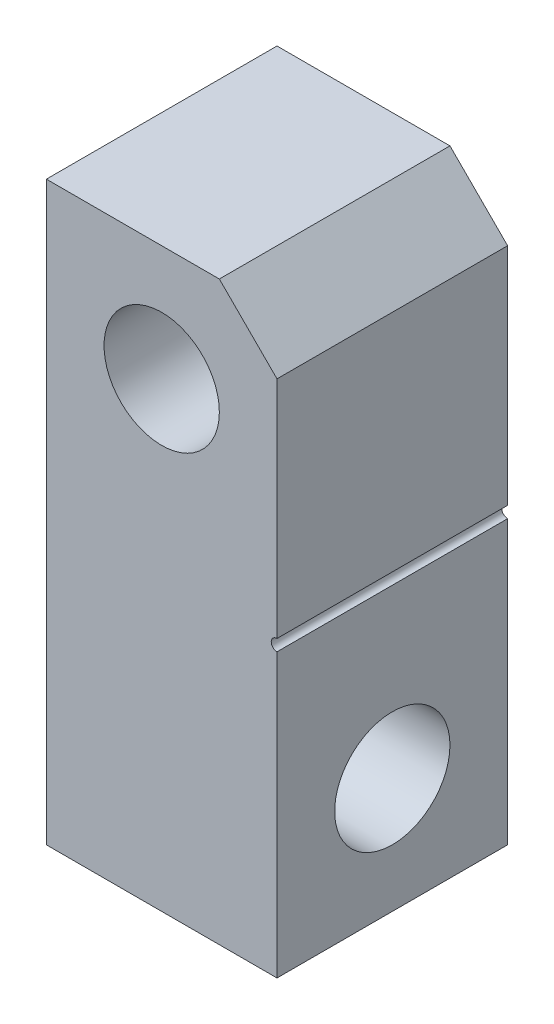
ISO-10303-21;
HEADER;
FILE_DESCRIPTION(('STEP AP214'),'2;1');
FILE_NAME('part.step','',(''),(''),'','','');
FILE_SCHEMA(('AUTOMOTIVE_DESIGN { 1 0 10303 214 1 1 1 1 }'));
ENDSEC;
DATA;
#1=APPLICATION_CONTEXT('core data for automotive mechanical design processes');
#2=APPLICATION_PROTOCOL_DEFINITION('international standard','automotive_design',2000,#1);
#3=PRODUCT_CONTEXT('',#1,'mechanical');
#4=PRODUCT('Part','Part','',(#3));
#5=PRODUCT_RELATED_PRODUCT_CATEGORY('part','',(#4));
#6=PRODUCT_DEFINITION_FORMATION('','',#4);
#7=PRODUCT_DEFINITION_CONTEXT('part definition',#1,'design');
#8=PRODUCT_DEFINITION('design','',#6,#7);
#9=PRODUCT_DEFINITION_SHAPE('','',#8);
#10=(LENGTH_UNIT() NAMED_UNIT(*) SI_UNIT(.MILLI.,.METRE.));
#11=(NAMED_UNIT(*) PLANE_ANGLE_UNIT() SI_UNIT($,.RADIAN.));
#12=(NAMED_UNIT(*) SI_UNIT($,.STERADIAN.) SOLID_ANGLE_UNIT());
#13=UNCERTAINTY_MEASURE_WITH_UNIT(LENGTH_MEASURE(1.E-05),#10,'distance_accuracy_value','');
#14=(GEOMETRIC_REPRESENTATION_CONTEXT(3) GLOBAL_UNCERTAINTY_ASSIGNED_CONTEXT((#13)) GLOBAL_UNIT_ASSIGNED_CONTEXT((#10,
#11,#12)) REPRESENTATION_CONTEXT('',''));
#15=CARTESIAN_POINT('',(0.,0.,0.));
#16=DIRECTION('',(0.,0.,1.));
#17=DIRECTION('',(1.,0.,0.));
#18=AXIS2_PLACEMENT_3D('',#15,#16,#17);
#19=CARTESIAN_POINT('',(20.,0.,-20.));
#20=DIRECTION('',(1.,0.,0.));
#21=DIRECTION('',(0.,0.,-1.));
#22=AXIS2_PLACEMENT_3D('',#19,#20,#21);
#23=PLANE('',#22);
#24=DIRECTION('',(0.,0.,1.));
#25=VECTOR('',#24,1.);
#26=CARTESIAN_POINT('',(20.,25.5,-20.));
#27=LINE('',#26,#25);
#28=CARTESIAN_POINT('',(20.,25.5,-20.));
#29=VERTEX_POINT('',#28);
#30=CARTESIAN_POINT('',(20.,25.5,0.));
#31=VERTEX_POINT('',#30);
#32=EDGE_CURVE('E57',#29,#31,#27,.T.);
#33=ORIENTED_EDGE('',*,*,#32,.F.);
#34=DIRECTION('',(0.,1.,0.));
#35=VECTOR('',#34,1.);
#36=CARTESIAN_POINT('',(20.,0.,-20.));
#37=LINE('',#36,#35);
#38=CARTESIAN_POINT('',(20.,45.,-20.));
#39=VERTEX_POINT('',#38);
#40=EDGE_CURVE('E114',#29,#39,#37,.T.);
#41=ORIENTED_EDGE('',*,*,#40,.T.);
#42=DIRECTION('',(0.,0.,1.));
#43=VECTOR('',#42,1.);
#44=CARTESIAN_POINT('',(20.,45.,-20.));
#45=LINE('',#44,#43);
#46=CARTESIAN_POINT('',(20.,45.,0.));
#47=VERTEX_POINT('',#46);
#48=EDGE_CURVE('E143',#39,#47,#45,.T.);
#49=ORIENTED_EDGE('',*,*,#48,.T.);
#50=DIRECTION('',(0.,1.,0.));
#51=VECTOR('',#50,1.);
#52=CARTESIAN_POINT('',(20.,0.,0.));
#53=LINE('',#52,#51);
#54=EDGE_CURVE('E116',#31,#47,#53,.T.);
#55=ORIENTED_EDGE('',*,*,#54,.F.);
#56=EDGE_LOOP('',(#33,#41,#49,#55));
#57=FACE_BOUND('',#56,.T.);
#58=ADVANCED_FACE('F39',(#57),#23,.T.);
#59=CARTESIAN_POINT('',(0.,50.,-20.));
#60=DIRECTION('',(-1.,0.,0.));
#61=DIRECTION('',(0.,-1.,0.));
#62=AXIS2_PLACEMENT_3D('',#59,#60,#61);
#63=PLANE('',#62);
#64=CARTESIAN_POINT('',(0.,10.,-10.));
#65=DIRECTION('',(1.,0.,0.));
#66=DIRECTION('',(0.,0.,-1.));
#67=AXIS2_PLACEMENT_3D('',#64,#65,#66);
#68=CIRCLE('',#67,5.);
#69=CARTESIAN_POINT('',(0.,10.,-15.));
#70=VERTEX_POINT('',#69);
#71=EDGE_CURVE('E180',#70,#70,#68,.T.);
#72=ORIENTED_EDGE('',*,*,#71,.T.);
#73=EDGE_LOOP('',(#72));
#74=FACE_BOUND('',#73,.T.);
#75=DIRECTION('',(0.,-1.,0.));
#76=VECTOR('',#75,1.);
#77=CARTESIAN_POINT('',(0.,50.,0.));
#78=LINE('',#77,#76);
#79=CARTESIAN_POINT('',(0.,50.,0.));
#80=VERTEX_POINT('',#79);
#81=CARTESIAN_POINT('',(0.,0.,0.));
#82=VERTEX_POINT('',#81);
#83=EDGE_CURVE('E138',#80,#82,#78,.T.);
#84=ORIENTED_EDGE('',*,*,#83,.F.);
#85=DIRECTION('',(0.,0.,1.));
#86=VECTOR('',#85,1.);
#87=CARTESIAN_POINT('',(0.,50.,-20.));
#88=LINE('',#87,#86);
#89=CARTESIAN_POINT('',(0.,50.,-20.));
#90=VERTEX_POINT('',#89);
#91=EDGE_CURVE('E11',#90,#80,#88,.T.);
#92=ORIENTED_EDGE('',*,*,#91,.F.);
#93=DIRECTION('',(0.,-1.,0.));
#94=VECTOR('',#93,1.);
#95=CARTESIAN_POINT('',(0.,50.,-20.));
#96=LINE('',#95,#94);
#97=CARTESIAN_POINT('',(0.,0.,-20.));
#98=VERTEX_POINT('',#97);
#99=EDGE_CURVE('E132',#90,#98,#96,.T.);
#100=ORIENTED_EDGE('',*,*,#99,.T.);
#101=DIRECTION('',(0.,0.,1.));
#102=VECTOR('',#101,1.);
#103=CARTESIAN_POINT('',(0.,0.,-20.));
#104=LINE('',#103,#102);
#105=EDGE_CURVE('E43',#98,#82,#104,.T.);
#106=ORIENTED_EDGE('',*,*,#105,.T.);
#107=EDGE_LOOP('',(#84,#92,#100,#106));
#108=FACE_BOUND('',#107,.T.);
#109=ADVANCED_FACE('F41',(#74,#108),#63,.T.);
#110=CARTESIAN_POINT('',(20.,50.,-20.));
#111=DIRECTION('',(0.,1.,0.));
#112=DIRECTION('',(0.,0.,1.));
#113=AXIS2_PLACEMENT_3D('',#110,#111,#112);
#114=PLANE('',#113);
#115=DIRECTION('',(0.,0.,1.));
#116=VECTOR('',#115,1.);
#117=CARTESIAN_POINT('',(15.,50.,-20.));
#118=LINE('',#117,#116);
#119=CARTESIAN_POINT('',(15.,50.,-20.));
#120=VERTEX_POINT('',#119);
#121=CARTESIAN_POINT('',(15.,50.,0.));
#122=VERTEX_POINT('',#121);
#123=EDGE_CURVE('E65',#120,#122,#118,.T.);
#124=ORIENTED_EDGE('',*,*,#123,.F.);
#125=DIRECTION('',(-1.,0.,0.));
#126=VECTOR('',#125,1.);
#127=CARTESIAN_POINT('',(20.,50.,-20.));
#128=LINE('',#127,#126);
#129=EDGE_CURVE('E130',#120,#90,#128,.T.);
#130=ORIENTED_EDGE('',*,*,#129,.T.);
#131=ORIENTED_EDGE('',*,*,#91,.T.);
#132=DIRECTION('',(-1.,0.,0.));
#133=VECTOR('',#132,1.);
#134=CARTESIAN_POINT('',(20.,50.,0.));
#135=LINE('',#134,#133);
#136=EDGE_CURVE('E151',#122,#80,#135,.T.);
#137=ORIENTED_EDGE('',*,*,#136,.F.);
#138=EDGE_LOOP('',(#124,#130,#131,#137));
#139=FACE_BOUND('',#138,.T.);
#140=ADVANCED_FACE('F171',(#139),#114,.T.);
#141=DIRECTION('',(0.,0.,1.));
#142=VECTOR('',#141,1.);
#143=CARTESIAN_POINT('',(20.,24.5,-20.));
#144=LINE('',#143,#142);
#145=CARTESIAN_POINT('',(20.,24.5,0.));
#146=VERTEX_POINT('',#145);
#147=CARTESIAN_POINT('',(20.,24.5,-20.));
#148=VERTEX_POINT('',#147);
#149=EDGE_CURVE('E103',#146,#148,#144,.F.);
#150=ORIENTED_EDGE('',*,*,#149,.F.);
#151=CARTESIAN_POINT('',(20.,0.,0.));
#152=VERTEX_POINT('',#151);
#153=EDGE_CURVE('E147',#152,#146,#53,.T.);
#154=ORIENTED_EDGE('',*,*,#153,.F.);
#155=DIRECTION('',(0.,0.,1.));
#156=VECTOR('',#155,1.);
#157=CARTESIAN_POINT('',(20.,0.,-20.));
#158=LINE('',#157,#156);
#159=CARTESIAN_POINT('',(20.,0.,-20.));
#160=VERTEX_POINT('',#159);
#161=EDGE_CURVE('E49',#160,#152,#158,.T.);
#162=ORIENTED_EDGE('',*,*,#161,.F.);
#163=EDGE_CURVE('E125',#160,#148,#37,.T.);
#164=ORIENTED_EDGE('',*,*,#163,.T.);
#165=EDGE_LOOP('',(#150,#154,#162,#164));
#166=FACE_BOUND('',#165,.T.);
#167=CARTESIAN_POINT('',(20.,10.,-10.));
#168=DIRECTION('',(1.,0.,0.));
#169=DIRECTION('',(0.,0.,-1.));
#170=AXIS2_PLACEMENT_3D('',#167,#168,#169);
#171=CIRCLE('',#170,5.);
#172=CARTESIAN_POINT('',(20.,10.,-15.));
#173=VERTEX_POINT('',#172);
#174=EDGE_CURVE('E183',#173,#173,#171,.T.);
#175=ORIENTED_EDGE('',*,*,#174,.F.);
#176=EDGE_LOOP('',(#175));
#177=FACE_BOUND('',#176,.T.);
#178=ADVANCED_FACE('F201',(#166,#177),#23,.T.);
#179=CARTESIAN_POINT('',(0.,0.,-20.));
#180=DIRECTION('',(0.,-1.,0.));
#181=DIRECTION('',(0.,0.,-1.));
#182=AXIS2_PLACEMENT_3D('',#179,#180,#181);
#183=PLANE('',#182);
#184=DIRECTION('',(1.,0.,0.));
#185=VECTOR('',#184,1.);
#186=CARTESIAN_POINT('',(0.,0.,0.));
#187=LINE('',#186,#185);
#188=EDGE_CURVE('E142',#82,#152,#187,.T.);
#189=ORIENTED_EDGE('',*,*,#188,.F.);
#190=ORIENTED_EDGE('',*,*,#105,.F.);
#191=DIRECTION('',(1.,0.,0.));
#192=VECTOR('',#191,1.);
#193=CARTESIAN_POINT('',(0.,0.,-20.));
#194=LINE('',#193,#192);
#195=EDGE_CURVE('E126',#98,#160,#194,.T.);
#196=ORIENTED_EDGE('',*,*,#195,.T.);
#197=ORIENTED_EDGE('',*,*,#161,.T.);
#198=EDGE_LOOP('',(#189,#190,#196,#197));
#199=FACE_BOUND('',#198,.T.);
#200=ADVANCED_FACE('F164',(#199),#183,.T.);
#201=CARTESIAN_POINT('',(0.,0.,-20.));
#202=DIRECTION('',(0.,0.,1.));
#203=DIRECTION('',(1.,0.,0.));
#204=AXIS2_PLACEMENT_3D('',#201,#202,#203);
#205=PLANE('',#204);
#206=CARTESIAN_POINT('',(10.,40.,-20.));
#207=DIRECTION('',(0.,0.,1.));
#208=DIRECTION('',(1.,0.,0.));
#209=AXIS2_PLACEMENT_3D('',#206,#207,#208);
#210=CIRCLE('',#209,5.);
#211=CARTESIAN_POINT('',(15.,40.,-20.));
#212=VERTEX_POINT('',#211);
#213=EDGE_CURVE('E187',#212,#212,#210,.T.);
#214=ORIENTED_EDGE('',*,*,#213,.T.);
#215=EDGE_LOOP('',(#214));
#216=FACE_BOUND('',#215,.T.);
#217=ORIENTED_EDGE('',*,*,#40,.F.);
#218=CARTESIAN_POINT('',(20.,25.,-20.));
#219=DIRECTION('',(0.,0.,1.));
#220=DIRECTION('',(1.,0.,0.));
#221=AXIS2_PLACEMENT_3D('',#218,#219,#220);
#222=CIRCLE('',#221,0.499999999999999);
#223=EDGE_CURVE('E100',#29,#148,#222,.T.);
#224=ORIENTED_EDGE('',*,*,#223,.T.);
#225=ORIENTED_EDGE('',*,*,#163,.F.);
#226=ORIENTED_EDGE('',*,*,#195,.F.);
#227=ORIENTED_EDGE('',*,*,#99,.F.);
#228=ORIENTED_EDGE('',*,*,#129,.F.);
#229=DIRECTION('',(0.707106781186548,-0.707106781186547,0.));
#230=VECTOR('',#229,1.);
#231=CARTESIAN_POINT('',(15.,50.,-20.));
#232=LINE('',#231,#230);
#233=EDGE_CURVE('E123',#120,#39,#232,.T.);
#234=ORIENTED_EDGE('',*,*,#233,.T.);
#235=EDGE_LOOP('',(#217,#224,#225,#226,#227,#228,#234));
#236=FACE_BOUND('',#235,.T.);
#237=ADVANCED_FACE('F121',(#216,#236),#205,.F.);
#238=CARTESIAN_POINT('',(0.,0.,0.));
#239=DIRECTION('',(0.,0.,1.));
#240=DIRECTION('',(1.,0.,0.));
#241=AXIS2_PLACEMENT_3D('',#238,#239,#240);
#242=PLANE('',#241);
#243=CARTESIAN_POINT('',(20.,25.,0.));
#244=DIRECTION('',(0.,0.,1.));
#245=DIRECTION('',(1.,0.,0.));
#246=AXIS2_PLACEMENT_3D('',#243,#244,#245);
#247=CIRCLE('',#246,0.499999999999999);
#248=EDGE_CURVE('E109',#31,#146,#247,.T.);
#249=ORIENTED_EDGE('',*,*,#248,.F.);
#250=ORIENTED_EDGE('',*,*,#54,.T.);
#251=DIRECTION('',(0.707106781186548,-0.707106781186547,0.));
#252=VECTOR('',#251,1.);
#253=CARTESIAN_POINT('',(15.,50.,0.));
#254=LINE('',#253,#252);
#255=EDGE_CURVE('E169',#122,#47,#254,.T.);
#256=ORIENTED_EDGE('',*,*,#255,.F.);
#257=ORIENTED_EDGE('',*,*,#136,.T.);
#258=ORIENTED_EDGE('',*,*,#83,.T.);
#259=ORIENTED_EDGE('',*,*,#188,.T.);
#260=ORIENTED_EDGE('',*,*,#153,.T.);
#261=EDGE_LOOP('',(#249,#250,#256,#257,#258,#259,#260));
#262=FACE_BOUND('',#261,.T.);
#263=CARTESIAN_POINT('',(10.,40.,0.));
#264=DIRECTION('',(0.,0.,1.));
#265=DIRECTION('',(1.,0.,0.));
#266=AXIS2_PLACEMENT_3D('',#263,#264,#265);
#267=CIRCLE('',#266,5.);
#268=CARTESIAN_POINT('',(15.,40.,0.));
#269=VERTEX_POINT('',#268);
#270=EDGE_CURVE('E118',#269,#269,#267,.T.);
#271=ORIENTED_EDGE('',*,*,#270,.F.);
#272=EDGE_LOOP('',(#271));
#273=FACE_BOUND('',#272,.T.);
#274=ADVANCED_FACE('F166',(#262,#273),#242,.T.);
#275=CARTESIAN_POINT('',(15.,50.,-20.));
#276=DIRECTION('',(-0.707106781186547,-0.707106781186548,0.));
#277=DIRECTION('',(0.707106781186548,-0.707106781186547,0.));
#278=AXIS2_PLACEMENT_3D('',#275,#276,#277);
#279=PLANE('',#278);
#280=ORIENTED_EDGE('',*,*,#255,.T.);
#281=ORIENTED_EDGE('',*,*,#48,.F.);
#282=ORIENTED_EDGE('',*,*,#233,.F.);
#283=ORIENTED_EDGE('',*,*,#123,.T.);
#284=EDGE_LOOP('',(#280,#281,#282,#283));
#285=FACE_BOUND('',#284,.T.);
#286=ADVANCED_FACE('F210',(#285),#279,.F.);
#287=CARTESIAN_POINT('',(0.,10.,-10.));
#288=DIRECTION('',(1.,0.,0.));
#289=DIRECTION('',(0.,0.,-1.));
#290=AXIS2_PLACEMENT_3D('',#287,#288,#289);
#291=CYLINDRICAL_SURFACE('',#290,5.);
#292=ORIENTED_EDGE('',*,*,#71,.F.);
#293=EDGE_LOOP('',(#292));
#294=FACE_BOUND('',#293,.T.);
#295=ORIENTED_EDGE('',*,*,#174,.T.);
#296=EDGE_LOOP('',(#295));
#297=FACE_BOUND('',#296,.T.);
#298=ADVANCED_FACE('F207',(#294,#297),#291,.F.);
#299=CARTESIAN_POINT('',(10.,40.,-20.));
#300=DIRECTION('',(0.,0.,1.));
#301=DIRECTION('',(1.,0.,0.));
#302=AXIS2_PLACEMENT_3D('',#299,#300,#301);
#303=CYLINDRICAL_SURFACE('',#302,5.);
#304=ORIENTED_EDGE('',*,*,#213,.F.);
#305=EDGE_LOOP('',(#304));
#306=FACE_BOUND('',#305,.T.);
#307=ORIENTED_EDGE('',*,*,#270,.T.);
#308=EDGE_LOOP('',(#307));
#309=FACE_BOUND('',#308,.T.);
#310=ADVANCED_FACE('F209',(#306,#309),#303,.F.);
#311=CARTESIAN_POINT('',(20.,25.,-20.));
#312=DIRECTION('',(0.,0.,1.));
#313=DIRECTION('',(1.,0.,0.));
#314=AXIS2_PLACEMENT_3D('',#311,#312,#313);
#315=CYLINDRICAL_SURFACE('',#314,0.499999999999999);
#316=ORIENTED_EDGE('',*,*,#32,.T.);
#317=ORIENTED_EDGE('',*,*,#248,.T.);
#318=ORIENTED_EDGE('',*,*,#149,.T.);
#319=ORIENTED_EDGE('',*,*,#223,.F.);
#320=EDGE_LOOP('',(#316,#317,#318,#319));
#321=FACE_BOUND('',#320,.T.);
#322=ADVANCED_FACE('F101',(#321),#315,.F.);
#323=CLOSED_SHELL('',(#58,#109,#140,#178,#200,#237,#274,#286,#298,#310,#322));
#324=MANIFOLD_SOLID_BREP('B2',#323);
#325=ADVANCED_BREP_SHAPE_REPRESENTATION('',(#18,#324),#14);
#326=SHAPE_DEFINITION_REPRESENTATION(#9,#325);
ENDSEC;
END-ISO-10303-21;
